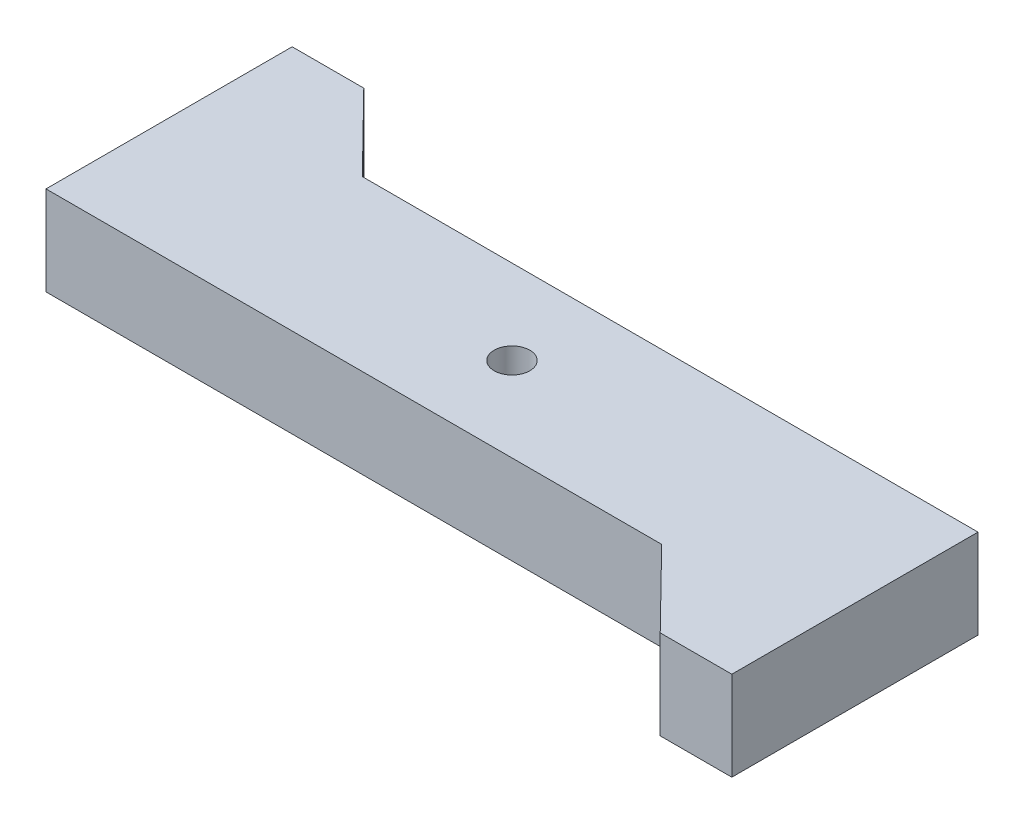
ISO-10303-21;
HEADER;
FILE_DESCRIPTION(('STEP AP214'),'2;1');
FILE_NAME('part.step','',(''),(''),'','','');
FILE_SCHEMA(('AUTOMOTIVE_DESIGN { 1 0 10303 214 1 1 1 1 }'));
ENDSEC;
DATA;
#1=APPLICATION_CONTEXT('core data for automotive mechanical design processes');
#2=APPLICATION_PROTOCOL_DEFINITION('international standard','automotive_design',2000,#1);
#3=PRODUCT_CONTEXT('',#1,'mechanical');
#4=PRODUCT('Part','Part','',(#3));
#5=PRODUCT_RELATED_PRODUCT_CATEGORY('part','',(#4));
#6=PRODUCT_DEFINITION_FORMATION('','',#4);
#7=PRODUCT_DEFINITION_CONTEXT('part definition',#1,'design');
#8=PRODUCT_DEFINITION('design','',#6,#7);
#9=PRODUCT_DEFINITION_SHAPE('','',#8);
#10=(LENGTH_UNIT() NAMED_UNIT(*) SI_UNIT(.MILLI.,.METRE.));
#11=(NAMED_UNIT(*) PLANE_ANGLE_UNIT() SI_UNIT($,.RADIAN.));
#12=(NAMED_UNIT(*) SI_UNIT($,.STERADIAN.) SOLID_ANGLE_UNIT());
#13=UNCERTAINTY_MEASURE_WITH_UNIT(LENGTH_MEASURE(1.E-05),#10,'distance_accuracy_value','');
#14=(GEOMETRIC_REPRESENTATION_CONTEXT(3) GLOBAL_UNCERTAINTY_ASSIGNED_CONTEXT((#13)) GLOBAL_UNIT_ASSIGNED_CONTEXT((#10,
#11,#12)) REPRESENTATION_CONTEXT('',''));
#15=CARTESIAN_POINT('',(0.,0.,0.));
#16=DIRECTION('',(0.,0.,1.));
#17=DIRECTION('',(1.,0.,0.));
#18=AXIS2_PLACEMENT_3D('',#15,#16,#17);
#19=CARTESIAN_POINT('',(-85.5361203693583,20.,-18.9152891521855));
#20=DIRECTION('',(1.,0.,0.));
#21=DIRECTION('',(0.,0.,-1.));
#22=AXIS2_PLACEMENT_3D('',#19,#20,#21);
#23=PLANE('',#22);
#24=DIRECTION('',(0.,0.,1.));
#25=VECTOR('',#24,1.);
#26=CARTESIAN_POINT('',(-85.5361203693583,0.,-18.9152891521855));
#27=LINE('',#26,#25);
#28=CARTESIAN_POINT('',(-85.5361203693583,0.,-36.2604758953691));
#29=VERTEX_POINT('',#28);
#30=CARTESIAN_POINT('',(-85.5361203693583,0.,18.9152891521855));
#31=VERTEX_POINT('',#30);
#32=EDGE_CURVE('E92',#29,#31,#27,.T.);
#33=ORIENTED_EDGE('',*,*,#32,.T.);
#34=DIRECTION('',(0.,-1.,0.));
#35=VECTOR('',#34,1.);
#36=CARTESIAN_POINT('',(-85.5361203693583,20.,18.9152891521855));
#37=LINE('',#36,#35);
#38=CARTESIAN_POINT('',(-85.5361203693583,20.,18.9152891521855));
#39=VERTEX_POINT('',#38);
#40=EDGE_CURVE('E11',#39,#31,#37,.T.);
#41=ORIENTED_EDGE('',*,*,#40,.F.);
#42=DIRECTION('',(0.,0.,1.));
#43=VECTOR('',#42,1.);
#44=CARTESIAN_POINT('',(-85.5361203693583,20.,-18.9152891521855));
#45=LINE('',#44,#43);
#46=CARTESIAN_POINT('',(-85.5361203693583,20.,-36.2604758953691));
#47=VERTEX_POINT('',#46);
#48=EDGE_CURVE('E98',#47,#39,#45,.T.);
#49=ORIENTED_EDGE('',*,*,#48,.F.);
#50=DIRECTION('',(0.,-1.,0.));
#51=VECTOR('',#50,1.);
#52=CARTESIAN_POINT('',(-85.5361203693583,20.,-36.2604758953691));
#53=LINE('',#52,#51);
#54=EDGE_CURVE('E136',#47,#29,#53,.T.);
#55=ORIENTED_EDGE('',*,*,#54,.T.);
#56=EDGE_LOOP('',(#33,#41,#49,#55));
#57=FACE_BOUND('',#56,.T.);
#58=ADVANCED_FACE('F39',(#57),#23,.F.);
#59=CARTESIAN_POINT('',(-85.5361203693583,20.,18.9152891521855));
#60=DIRECTION('',(0.,0.,-1.));
#61=DIRECTION('',(-1.,0.,0.));
#62=AXIS2_PLACEMENT_3D('',#59,#60,#61);
#63=PLANE('',#62);
#64=DIRECTION('',(1.,0.,0.));
#65=VECTOR('',#64,1.);
#66=CARTESIAN_POINT('',(-85.5361203693583,0.,18.9152891521855));
#67=LINE('',#66,#65);
#68=CARTESIAN_POINT('',(52.4638796306417,0.,18.9152891521855));
#69=VERTEX_POINT('',#68);
#70=EDGE_CURVE('E142',#31,#69,#67,.T.);
#71=ORIENTED_EDGE('',*,*,#70,.T.);
#72=DIRECTION('',(0.,-1.,0.));
#73=VECTOR('',#72,1.);
#74=CARTESIAN_POINT('',(52.4638796306417,20.,18.9152891521855));
#75=LINE('',#74,#73);
#76=CARTESIAN_POINT('',(52.4638796306417,20.,18.9152891521855));
#77=VERTEX_POINT('',#76);
#78=EDGE_CURVE('E48',#77,#69,#75,.T.);
#79=ORIENTED_EDGE('',*,*,#78,.F.);
#80=DIRECTION('',(1.,0.,0.));
#81=VECTOR('',#80,1.);
#82=CARTESIAN_POINT('',(-85.5361203693583,20.,18.9152891521855));
#83=LINE('',#82,#81);
#84=EDGE_CURVE('E203',#39,#77,#83,.T.);
#85=ORIENTED_EDGE('',*,*,#84,.F.);
#86=ORIENTED_EDGE('',*,*,#40,.T.);
#87=EDGE_LOOP('',(#71,#79,#85,#86));
#88=FACE_BOUND('',#87,.T.);
#89=ADVANCED_FACE('F234',(#88),#63,.F.);
#90=CARTESIAN_POINT('',(69.4840005392539,20.,36.2604758953691));
#91=DIRECTION('',(0.713763463235337,0.,-0.700386834935022));
#92=DIRECTION('',(-0.700386834935022,0.,-0.713763463235337));
#93=AXIS2_PLACEMENT_3D('',#90,#91,#92);
#94=PLANE('',#93);
#95=DIRECTION('',(0.700386834935022,0.,0.713763463235337));
#96=VECTOR('',#95,1.);
#97=CARTESIAN_POINT('',(69.4840005392539,0.,36.2604758953691));
#98=LINE('',#97,#96);
#99=CARTESIAN_POINT('',(69.4840005392539,0.,36.2604758953691));
#100=VERTEX_POINT('',#99);
#101=EDGE_CURVE('E146',#69,#100,#98,.T.);
#102=ORIENTED_EDGE('',*,*,#101,.T.);
#103=DIRECTION('',(0.,-1.,0.));
#104=VECTOR('',#103,1.);
#105=CARTESIAN_POINT('',(69.4840005392539,20.,36.2604758953691));
#106=LINE('',#105,#104);
#107=CARTESIAN_POINT('',(69.4840005392539,20.,36.2604758953691));
#108=VERTEX_POINT('',#107);
#109=EDGE_CURVE('E174',#108,#100,#106,.T.);
#110=ORIENTED_EDGE('',*,*,#109,.F.);
#111=DIRECTION('',(0.700386834935022,0.,0.713763463235337));
#112=VECTOR('',#111,1.);
#113=CARTESIAN_POINT('',(69.4840005392539,20.,36.2604758953691));
#114=LINE('',#113,#112);
#115=EDGE_CURVE('E185',#77,#108,#114,.T.);
#116=ORIENTED_EDGE('',*,*,#115,.F.);
#117=ORIENTED_EDGE('',*,*,#78,.T.);
#118=EDGE_LOOP('',(#102,#110,#116,#117));
#119=FACE_BOUND('',#118,.T.);
#120=ADVANCED_FACE('F183',(#119),#94,.F.);
#121=CARTESIAN_POINT('',(85.5361203693583,20.,36.2604758953691));
#122=DIRECTION('',(0.,0.,-1.));
#123=DIRECTION('',(-1.,0.,0.));
#124=AXIS2_PLACEMENT_3D('',#121,#122,#123);
#125=PLANE('',#124);
#126=DIRECTION('',(1.,0.,0.));
#127=VECTOR('',#126,1.);
#128=CARTESIAN_POINT('',(85.5361203693583,0.,36.2604758953691));
#129=LINE('',#128,#127);
#130=CARTESIAN_POINT('',(85.5361203693583,0.,36.2604758953691));
#131=VERTEX_POINT('',#130);
#132=EDGE_CURVE('E149',#100,#131,#129,.T.);
#133=ORIENTED_EDGE('',*,*,#132,.T.);
#134=DIRECTION('',(0.,-1.,0.));
#135=VECTOR('',#134,1.);
#136=CARTESIAN_POINT('',(85.5361203693583,20.,36.2604758953691));
#137=LINE('',#136,#135);
#138=CARTESIAN_POINT('',(85.5361203693583,20.,36.2604758953691));
#139=VERTEX_POINT('',#138);
#140=EDGE_CURVE('E170',#139,#131,#137,.T.);
#141=ORIENTED_EDGE('',*,*,#140,.F.);
#142=DIRECTION('',(1.,0.,0.));
#143=VECTOR('',#142,1.);
#144=CARTESIAN_POINT('',(85.5361203693583,20.,36.2604758953691));
#145=LINE('',#144,#143);
#146=EDGE_CURVE('E197',#108,#139,#145,.T.);
#147=ORIENTED_EDGE('',*,*,#146,.F.);
#148=ORIENTED_EDGE('',*,*,#109,.T.);
#149=EDGE_LOOP('',(#133,#141,#147,#148));
#150=FACE_BOUND('',#149,.T.);
#151=ADVANCED_FACE('F192',(#150),#125,.F.);
#152=CARTESIAN_POINT('',(85.5361203693583,20.,-18.9152891521855));
#153=DIRECTION('',(-1.,0.,0.));
#154=DIRECTION('',(0.,0.,1.));
#155=AXIS2_PLACEMENT_3D('',#152,#153,#154);
#156=PLANE('',#155);
#157=DIRECTION('',(0.,0.,-1.));
#158=VECTOR('',#157,1.);
#159=CARTESIAN_POINT('',(85.5361203693583,0.,-18.9152891521855));
#160=LINE('',#159,#158);
#161=CARTESIAN_POINT('',(85.5361203693583,0.,-18.9152891521855));
#162=VERTEX_POINT('',#161);
#163=EDGE_CURVE('E153',#131,#162,#160,.T.);
#164=ORIENTED_EDGE('',*,*,#163,.T.);
#165=DIRECTION('',(0.,-1.,0.));
#166=VECTOR('',#165,1.);
#167=CARTESIAN_POINT('',(85.5361203693583,20.,-18.9152891521855));
#168=LINE('',#167,#166);
#169=CARTESIAN_POINT('',(85.5361203693583,20.,-18.9152891521855));
#170=VERTEX_POINT('',#169);
#171=EDGE_CURVE('E129',#170,#162,#168,.T.);
#172=ORIENTED_EDGE('',*,*,#171,.F.);
#173=DIRECTION('',(0.,0.,-1.));
#174=VECTOR('',#173,1.);
#175=CARTESIAN_POINT('',(85.5361203693583,20.,18.9152891521855));
#176=LINE('',#175,#174);
#177=EDGE_CURVE('E118',#139,#170,#176,.T.);
#178=ORIENTED_EDGE('',*,*,#177,.F.);
#179=ORIENTED_EDGE('',*,*,#140,.T.);
#180=EDGE_LOOP('',(#164,#172,#178,#179));
#181=FACE_BOUND('',#180,.T.);
#182=ADVANCED_FACE('F195',(#181),#156,.F.);
#183=CARTESIAN_POINT('',(-52.4638796306417,20.,-18.9152891521855));
#184=DIRECTION('',(0.,0.,1.));
#185=DIRECTION('',(1.,0.,0.));
#186=AXIS2_PLACEMENT_3D('',#183,#184,#185);
#187=PLANE('',#186);
#188=DIRECTION('',(-1.,0.,0.));
#189=VECTOR('',#188,1.);
#190=CARTESIAN_POINT('',(-52.4638796306417,0.,-18.9152891521855));
#191=LINE('',#190,#189);
#192=CARTESIAN_POINT('',(-52.4638796306417,0.,-18.9152891521855));
#193=VERTEX_POINT('',#192);
#194=EDGE_CURVE('E127',#162,#193,#191,.T.);
#195=ORIENTED_EDGE('',*,*,#194,.T.);
#196=DIRECTION('',(0.,-1.,0.));
#197=VECTOR('',#196,1.);
#198=CARTESIAN_POINT('',(-52.4638796306417,20.,-18.9152891521855));
#199=LINE('',#198,#197);
#200=CARTESIAN_POINT('',(-52.4638796306417,20.,-18.9152891521855));
#201=VERTEX_POINT('',#200);
#202=EDGE_CURVE('E124',#201,#193,#199,.T.);
#203=ORIENTED_EDGE('',*,*,#202,.F.);
#204=DIRECTION('',(-1.,0.,0.));
#205=VECTOR('',#204,1.);
#206=CARTESIAN_POINT('',(-52.4638796306417,20.,-18.9152891521855));
#207=LINE('',#206,#205);
#208=EDGE_CURVE('E112',#170,#201,#207,.T.);
#209=ORIENTED_EDGE('',*,*,#208,.F.);
#210=ORIENTED_EDGE('',*,*,#171,.T.);
#211=EDGE_LOOP('',(#195,#203,#209,#210));
#212=FACE_BOUND('',#211,.T.);
#213=ADVANCED_FACE('F125',(#212),#187,.F.);
#214=CARTESIAN_POINT('',(-69.4840005392539,20.,-36.2604758953691));
#215=DIRECTION('',(-0.713763463235337,0.,0.700386834935022));
#216=DIRECTION('',(0.700386834935022,0.,0.713763463235337));
#217=AXIS2_PLACEMENT_3D('',#214,#215,#216);
#218=PLANE('',#217);
#219=DIRECTION('',(-0.700386834935022,0.,-0.713763463235337));
#220=VECTOR('',#219,1.);
#221=CARTESIAN_POINT('',(-69.4840005392539,0.,-36.2604758953691));
#222=LINE('',#221,#220);
#223=CARTESIAN_POINT('',(-69.4840005392539,0.,-36.2604758953691));
#224=VERTEX_POINT('',#223);
#225=EDGE_CURVE('E85',#193,#224,#222,.T.);
#226=ORIENTED_EDGE('',*,*,#225,.T.);
#227=DIRECTION('',(0.,-1.,0.));
#228=VECTOR('',#227,1.);
#229=CARTESIAN_POINT('',(-69.4840005392539,20.,-36.2604758953691));
#230=LINE('',#229,#228);
#231=CARTESIAN_POINT('',(-69.4840005392539,20.,-36.2604758953691));
#232=VERTEX_POINT('',#231);
#233=EDGE_CURVE('E130',#232,#224,#230,.T.);
#234=ORIENTED_EDGE('',*,*,#233,.F.);
#235=DIRECTION('',(-0.700386834935022,0.,-0.713763463235337));
#236=VECTOR('',#235,1.);
#237=CARTESIAN_POINT('',(-69.4840005392539,20.,-36.2604758953691));
#238=LINE('',#237,#236);
#239=EDGE_CURVE('E116',#201,#232,#238,.T.);
#240=ORIENTED_EDGE('',*,*,#239,.F.);
#241=ORIENTED_EDGE('',*,*,#202,.T.);
#242=EDGE_LOOP('',(#226,#234,#240,#241));
#243=FACE_BOUND('',#242,.T.);
#244=ADVANCED_FACE('F132',(#243),#218,.F.);
#245=CARTESIAN_POINT('',(-85.5361203693583,20.,-36.2604758953691));
#246=DIRECTION('',(0.,0.,1.));
#247=DIRECTION('',(1.,0.,0.));
#248=AXIS2_PLACEMENT_3D('',#245,#246,#247);
#249=PLANE('',#248);
#250=DIRECTION('',(-1.,0.,0.));
#251=VECTOR('',#250,1.);
#252=CARTESIAN_POINT('',(-85.5361203693583,0.,-36.2604758953691));
#253=LINE('',#252,#251);
#254=EDGE_CURVE('E160',#224,#29,#253,.T.);
#255=ORIENTED_EDGE('',*,*,#254,.T.);
#256=ORIENTED_EDGE('',*,*,#54,.F.);
#257=DIRECTION('',(-1.,0.,0.));
#258=VECTOR('',#257,1.);
#259=CARTESIAN_POINT('',(-85.5361203693583,20.,-36.2604758953691));
#260=LINE('',#259,#258);
#261=EDGE_CURVE('E56',#232,#47,#260,.T.);
#262=ORIENTED_EDGE('',*,*,#261,.F.);
#263=ORIENTED_EDGE('',*,*,#233,.T.);
#264=EDGE_LOOP('',(#255,#256,#262,#263));
#265=FACE_BOUND('',#264,.T.);
#266=ADVANCED_FACE('F224',(#265),#249,.F.);
#267=CARTESIAN_POINT('',(0.,20.,0.));
#268=DIRECTION('',(0.,-1.,0.));
#269=DIRECTION('',(0.,0.,-1.));
#270=AXIS2_PLACEMENT_3D('',#267,#268,#269);
#271=PLANE('',#270);
#272=CARTESIAN_POINT('',(0.,20.,0.));
#273=DIRECTION('',(0.,1.,0.));
#274=DIRECTION('',(0.,0.,1.));
#275=AXIS2_PLACEMENT_3D('',#272,#273,#274);
#276=CIRCLE('',#275,4.);
#277=CARTESIAN_POINT('',(0.,20.,4.));
#278=VERTEX_POINT('',#277);
#279=EDGE_CURVE('E208',#278,#278,#276,.T.);
#280=ORIENTED_EDGE('',*,*,#279,.F.);
#281=EDGE_LOOP('',(#280));
#282=FACE_BOUND('',#281,.T.);
#283=ORIENTED_EDGE('',*,*,#48,.T.);
#284=ORIENTED_EDGE('',*,*,#84,.T.);
#285=ORIENTED_EDGE('',*,*,#115,.T.);
#286=ORIENTED_EDGE('',*,*,#146,.T.);
#287=ORIENTED_EDGE('',*,*,#177,.T.);
#288=ORIENTED_EDGE('',*,*,#208,.T.);
#289=ORIENTED_EDGE('',*,*,#239,.T.);
#290=ORIENTED_EDGE('',*,*,#261,.T.);
#291=EDGE_LOOP('',(#283,#284,#285,#286,#287,#288,#289,#290));
#292=FACE_BOUND('',#291,.T.);
#293=ADVANCED_FACE('F114',(#282,#292),#271,.F.);
#294=CARTESIAN_POINT('',(0.,0.,0.));
#295=DIRECTION('',(0.,-1.,0.));
#296=DIRECTION('',(0.,0.,-1.));
#297=AXIS2_PLACEMENT_3D('',#294,#295,#296);
#298=PLANE('',#297);
#299=CARTESIAN_POINT('',(0.,0.,0.));
#300=DIRECTION('',(0.,1.,0.));
#301=DIRECTION('',(0.,0.,1.));
#302=AXIS2_PLACEMENT_3D('',#299,#300,#301);
#303=CIRCLE('',#302,4.);
#304=CARTESIAN_POINT('',(0.,0.,4.));
#305=VERTEX_POINT('',#304);
#306=EDGE_CURVE('E143',#305,#305,#303,.T.);
#307=ORIENTED_EDGE('',*,*,#306,.T.);
#308=EDGE_LOOP('',(#307));
#309=FACE_BOUND('',#308,.T.);
#310=ORIENTED_EDGE('',*,*,#32,.F.);
#311=ORIENTED_EDGE('',*,*,#254,.F.);
#312=ORIENTED_EDGE('',*,*,#225,.F.);
#313=ORIENTED_EDGE('',*,*,#194,.F.);
#314=ORIENTED_EDGE('',*,*,#163,.F.);
#315=ORIENTED_EDGE('',*,*,#132,.F.);
#316=ORIENTED_EDGE('',*,*,#101,.F.);
#317=ORIENTED_EDGE('',*,*,#70,.F.);
#318=EDGE_LOOP('',(#310,#311,#312,#313,#314,#315,#316,#317));
#319=FACE_BOUND('',#318,.T.);
#320=ADVANCED_FACE('F189',(#309,#319),#298,.T.);
#321=CARTESIAN_POINT('',(0.,0.,0.));
#322=DIRECTION('',(0.,1.,0.));
#323=DIRECTION('',(0.,0.,1.));
#324=AXIS2_PLACEMENT_3D('',#321,#322,#323);
#325=CYLINDRICAL_SURFACE('',#324,4.);
#326=ORIENTED_EDGE('',*,*,#306,.F.);
#327=EDGE_LOOP('',(#326));
#328=FACE_BOUND('',#327,.T.);
#329=ORIENTED_EDGE('',*,*,#279,.T.);
#330=EDGE_LOOP('',(#329));
#331=FACE_BOUND('',#330,.T.);
#332=ADVANCED_FACE('F217',(#328,#331),#325,.F.);
#333=CLOSED_SHELL('',(#58,#89,#120,#151,#182,#213,#244,#266,#293,#320,#332));
#334=MANIFOLD_SOLID_BREP('B2',#333);
#335=ADVANCED_BREP_SHAPE_REPRESENTATION('',(#18,#334),#14);
#336=SHAPE_DEFINITION_REPRESENTATION(#9,#335);
ENDSEC;
END-ISO-10303-21;
